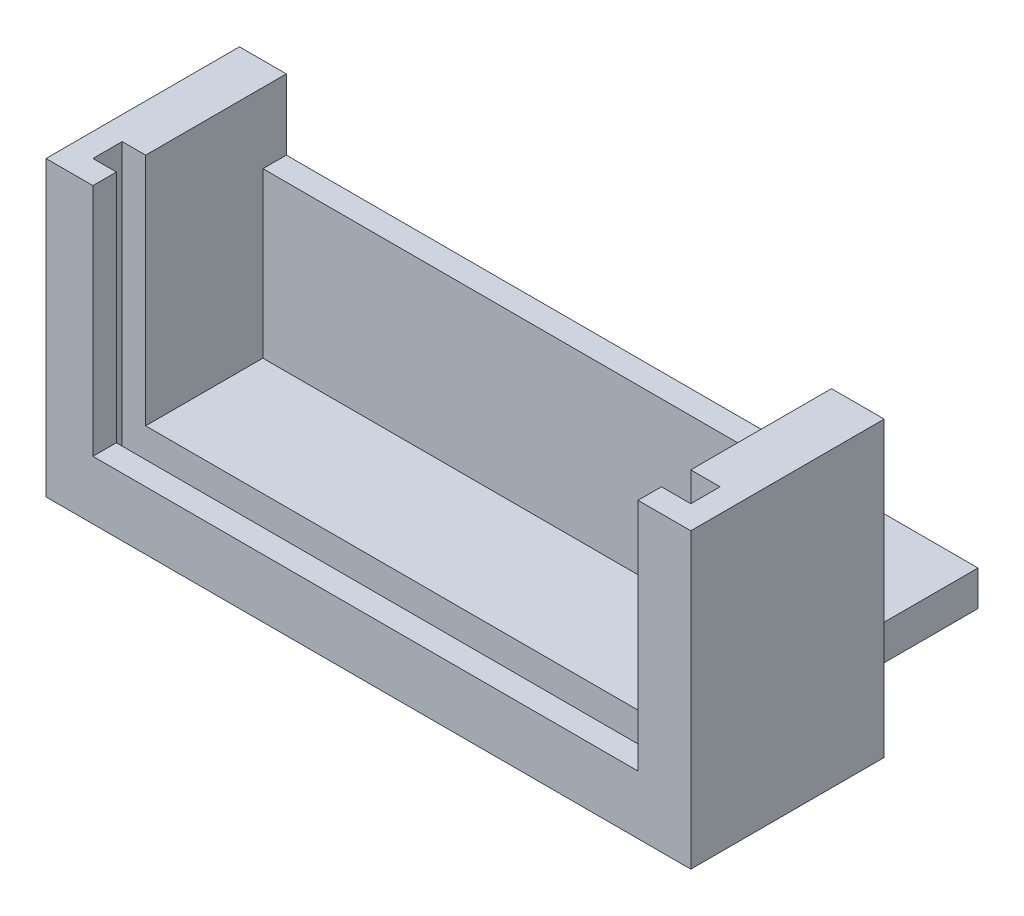
ISO-10303-21;
HEADER;
FILE_DESCRIPTION(('STEP AP214'),'2;1');
FILE_NAME('part.step','',(''),(''),'','','');
FILE_SCHEMA(('AUTOMOTIVE_DESIGN { 1 0 10303 214 1 1 1 1 }'));
ENDSEC;
DATA;
#1=APPLICATION_CONTEXT('core data for automotive mechanical design processes');
#2=APPLICATION_PROTOCOL_DEFINITION('international standard','automotive_design',2000,#1);
#3=PRODUCT_CONTEXT('',#1,'mechanical');
#4=PRODUCT('Part','Part','',(#3));
#5=PRODUCT_RELATED_PRODUCT_CATEGORY('part','',(#4));
#6=PRODUCT_DEFINITION_FORMATION('','',#4);
#7=PRODUCT_DEFINITION_CONTEXT('part definition',#1,'design');
#8=PRODUCT_DEFINITION('design','',#6,#7);
#9=PRODUCT_DEFINITION_SHAPE('','',#8);
#10=(LENGTH_UNIT() NAMED_UNIT(*) SI_UNIT(.MILLI.,.METRE.));
#11=(NAMED_UNIT(*) PLANE_ANGLE_UNIT() SI_UNIT($,.RADIAN.));
#12=(NAMED_UNIT(*) SI_UNIT($,.STERADIAN.) SOLID_ANGLE_UNIT());
#13=UNCERTAINTY_MEASURE_WITH_UNIT(LENGTH_MEASURE(1.E-05),#10,'distance_accuracy_value','');
#14=(GEOMETRIC_REPRESENTATION_CONTEXT(3) GLOBAL_UNCERTAINTY_ASSIGNED_CONTEXT((#13)) GLOBAL_UNIT_ASSIGNED_CONTEXT((#10,
#11,#12)) REPRESENTATION_CONTEXT('',''));
#15=CARTESIAN_POINT('',(0.,0.,0.));
#16=DIRECTION('',(0.,0.,1.));
#17=DIRECTION('',(1.,0.,0.));
#18=AXIS2_PLACEMENT_3D('',#15,#16,#17);
#19=CARTESIAN_POINT('',(0.,25.,16.5));
#20=DIRECTION('',(0.,-1.,0.));
#21=DIRECTION('',(1.,0.,0.));
#22=AXIS2_PLACEMENT_3D('',#19,#20,#21);
#23=PLANE('',#22);
#24=DIRECTION('',(0.,0.,1.));
#25=VECTOR('',#24,1.);
#26=CARTESIAN_POINT('',(4.,25.,2.));
#27=LINE('',#26,#25);
#28=CARTESIAN_POINT('',(4.,25.,0.));
#29=VERTEX_POINT('',#28);
#30=CARTESIAN_POINT('',(4.,25.,12.));
#31=VERTEX_POINT('',#30);
#32=EDGE_CURVE('E324',#29,#31,#27,.T.);
#33=ORIENTED_EDGE('',*,*,#32,.F.);
#34=DIRECTION('',(-1.,0.,0.));
#35=VECTOR('',#34,1.);
#36=CARTESIAN_POINT('',(0.,25.,0.));
#37=LINE('',#36,#35);
#38=CARTESIAN_POINT('',(0.,25.,0.));
#39=VERTEX_POINT('',#38);
#40=EDGE_CURVE('E260',#29,#39,#37,.T.);
#41=ORIENTED_EDGE('',*,*,#40,.T.);
#42=DIRECTION('',(0.,0.,-1.));
#43=VECTOR('',#42,1.);
#44=CARTESIAN_POINT('',(0.,25.,16.5));
#45=LINE('',#44,#43);
#46=CARTESIAN_POINT('',(0.,25.,16.5));
#47=VERTEX_POINT('',#46);
#48=EDGE_CURVE('E250',#47,#39,#45,.T.);
#49=ORIENTED_EDGE('',*,*,#48,.F.);
#50=DIRECTION('',(-1.,0.,0.));
#51=VECTOR('',#50,1.);
#52=CARTESIAN_POINT('',(0.,25.,16.5));
#53=LINE('',#52,#51);
#54=CARTESIAN_POINT('',(4.,25.,16.5));
#55=VERTEX_POINT('',#54);
#56=EDGE_CURVE('E246',#55,#47,#53,.T.);
#57=ORIENTED_EDGE('',*,*,#56,.F.);
#58=DIRECTION('',(0.,0.,1.));
#59=VECTOR('',#58,1.);
#60=CARTESIAN_POINT('',(4.,25.,14.5));
#61=LINE('',#60,#59);
#62=CARTESIAN_POINT('',(4.,25.,14.5));
#63=VERTEX_POINT('',#62);
#64=EDGE_CURVE('E311',#63,#55,#61,.T.);
#65=ORIENTED_EDGE('',*,*,#64,.F.);
#66=DIRECTION('',(1.,0.,0.));
#67=VECTOR('',#66,1.);
#68=CARTESIAN_POINT('',(2.,25.,14.5));
#69=LINE('',#68,#67);
#70=CARTESIAN_POINT('',(2.,25.,14.5));
#71=VERTEX_POINT('',#70);
#72=EDGE_CURVE('E308',#71,#63,#69,.T.);
#73=ORIENTED_EDGE('',*,*,#72,.F.);
#74=DIRECTION('',(0.,0.,1.));
#75=VECTOR('',#74,1.);
#76=CARTESIAN_POINT('',(2.,25.,12.));
#77=LINE('',#76,#75);
#78=CARTESIAN_POINT('',(2.,25.,12.));
#79=VERTEX_POINT('',#78);
#80=EDGE_CURVE('E305',#79,#71,#77,.T.);
#81=ORIENTED_EDGE('',*,*,#80,.F.);
#82=DIRECTION('',(-1.,0.,0.));
#83=VECTOR('',#82,1.);
#84=CARTESIAN_POINT('',(2.,25.,12.));
#85=LINE('',#84,#83);
#86=EDGE_CURVE('E326',#31,#79,#85,.T.);
#87=ORIENTED_EDGE('',*,*,#86,.F.);
#88=EDGE_LOOP('',(#33,#41,#49,#57,#65,#73,#81,#87));
#89=FACE_BOUND('',#88,.T.);
#90=ADVANCED_FACE('F43',(#89),#23,.F.);
#91=CARTESIAN_POINT('',(0.,5.,0.));
#92=DIRECTION('',(0.,1.,0.));
#93=DIRECTION('',(0.,0.,1.));
#94=AXIS2_PLACEMENT_3D('',#91,#92,#93);
#95=PLANE('',#94);
#96=DIRECTION('',(-1.,0.,0.));
#97=VECTOR('',#96,1.);
#98=CARTESIAN_POINT('',(0.,5.,12.));
#99=LINE('',#98,#97);
#100=CARTESIAN_POINT('',(50.5,5.,12.));
#101=VERTEX_POINT('',#100);
#102=CARTESIAN_POINT('',(4.,5.,12.));
#103=VERTEX_POINT('',#102);
#104=EDGE_CURVE('E11',#101,#103,#99,.T.);
#105=ORIENTED_EDGE('',*,*,#104,.F.);
#106=DIRECTION('',(0.,0.,-1.));
#107=VECTOR('',#106,1.);
#108=CARTESIAN_POINT('',(50.5,5.,2.));
#109=LINE('',#108,#107);
#110=CARTESIAN_POINT('',(50.5,5.,2.));
#111=VERTEX_POINT('',#110);
#112=EDGE_CURVE('E294',#101,#111,#109,.T.);
#113=ORIENTED_EDGE('',*,*,#112,.T.);
#114=DIRECTION('',(-1.,0.,0.));
#115=VECTOR('',#114,1.);
#116=CARTESIAN_POINT('',(4.,5.,2.));
#117=LINE('',#116,#115);
#118=CARTESIAN_POINT('',(4.,5.,2.));
#119=VERTEX_POINT('',#118);
#120=EDGE_CURVE('E297',#111,#119,#117,.T.);
#121=ORIENTED_EDGE('',*,*,#120,.T.);
#122=DIRECTION('',(0.,0.,1.));
#123=VECTOR('',#122,1.);
#124=CARTESIAN_POINT('',(4.,5.,2.));
#125=LINE('',#124,#123);
#126=EDGE_CURVE('E212',#119,#103,#125,.T.);
#127=ORIENTED_EDGE('',*,*,#126,.T.);
#128=EDGE_LOOP('',(#105,#113,#121,#127));
#129=FACE_BOUND('',#128,.T.);
#130=ADVANCED_FACE('F437',(#129),#95,.T.);
#131=CARTESIAN_POINT('',(0.,0.,16.5));
#132=DIRECTION('',(1.,0.,0.));
#133=DIRECTION('',(0.,0.,-1.));
#134=AXIS2_PLACEMENT_3D('',#131,#132,#133);
#135=PLANE('',#134);
#136=DIRECTION('',(0.,-1.,0.));
#137=VECTOR('',#136,1.);
#138=CARTESIAN_POINT('',(0.,0.,0.));
#139=LINE('',#138,#137);
#140=CARTESIAN_POINT('',(0.,0.,0.));
#141=VERTEX_POINT('',#140);
#142=EDGE_CURVE('E251',#39,#141,#139,.T.);
#143=ORIENTED_EDGE('',*,*,#142,.T.);
#144=DIRECTION('',(0.,0.,-1.));
#145=VECTOR('',#144,1.);
#146=CARTESIAN_POINT('',(0.,0.,16.5));
#147=LINE('',#146,#145);
#148=CARTESIAN_POINT('',(0.,0.,16.5));
#149=VERTEX_POINT('',#148);
#150=EDGE_CURVE('E271',#149,#141,#147,.T.);
#151=ORIENTED_EDGE('',*,*,#150,.F.);
#152=DIRECTION('',(0.,-1.,0.));
#153=VECTOR('',#152,1.);
#154=CARTESIAN_POINT('',(0.,0.,16.5));
#155=LINE('',#154,#153);
#156=EDGE_CURVE('E238',#47,#149,#155,.T.);
#157=ORIENTED_EDGE('',*,*,#156,.F.);
#158=ORIENTED_EDGE('',*,*,#48,.T.);
#159=EDGE_LOOP('',(#143,#151,#157,#158));
#160=FACE_BOUND('',#159,.T.);
#161=ADVANCED_FACE('F45',(#160),#135,.F.);
#162=CARTESIAN_POINT('',(0.,0.,16.5));
#163=DIRECTION('',(0.,1.,0.));
#164=DIRECTION('',(0.,0.,1.));
#165=AXIS2_PLACEMENT_3D('',#162,#163,#164);
#166=PLANE('',#165);
#167=DIRECTION('',(1.,0.,0.));
#168=VECTOR('',#167,1.);
#169=CARTESIAN_POINT('',(0.,0.,0.));
#170=LINE('',#169,#168);
#171=CARTESIAN_POINT('',(7.,0.,0.));
#172=VERTEX_POINT('',#171);
#173=EDGE_CURVE('E255',#141,#172,#170,.T.);
#174=ORIENTED_EDGE('',*,*,#173,.T.);
#175=DIRECTION('',(0.,0.,1.));
#176=VECTOR('',#175,1.);
#177=CARTESIAN_POINT('',(7.,0.,-15.));
#178=LINE('',#177,#176);
#179=CARTESIAN_POINT('',(7.,0.,-15.));
#180=VERTEX_POINT('',#179);
#181=EDGE_CURVE('E355',#180,#172,#178,.T.);
#182=ORIENTED_EDGE('',*,*,#181,.F.);
#183=DIRECTION('',(-1.,0.,0.));
#184=VECTOR('',#183,1.);
#185=CARTESIAN_POINT('',(48.,0.,-15.));
#186=LINE('',#185,#184);
#187=CARTESIAN_POINT('',(48.,0.,-15.));
#188=VERTEX_POINT('',#187);
#189=EDGE_CURVE('E390',#188,#180,#186,.T.);
#190=ORIENTED_EDGE('',*,*,#189,.F.);
#191=DIRECTION('',(0.,0.,1.));
#192=VECTOR('',#191,1.);
#193=CARTESIAN_POINT('',(48.,0.,-15.));
#194=LINE('',#193,#192);
#195=CARTESIAN_POINT('',(48.,0.,0.));
#196=VERTEX_POINT('',#195);
#197=EDGE_CURVE('E352',#188,#196,#194,.T.);
#198=ORIENTED_EDGE('',*,*,#197,.T.);
#199=CARTESIAN_POINT('',(55.,0.,0.));
#200=VERTEX_POINT('',#199);
#201=EDGE_CURVE('E254',#196,#200,#170,.T.);
#202=ORIENTED_EDGE('',*,*,#201,.T.);
#203=DIRECTION('',(0.,0.,-1.));
#204=VECTOR('',#203,1.);
#205=CARTESIAN_POINT('',(55.,0.,16.5));
#206=LINE('',#205,#204);
#207=CARTESIAN_POINT('',(55.,0.,16.5));
#208=VERTEX_POINT('',#207);
#209=EDGE_CURVE('E268',#208,#200,#206,.T.);
#210=ORIENTED_EDGE('',*,*,#209,.F.);
#211=DIRECTION('',(1.,0.,0.));
#212=VECTOR('',#211,1.);
#213=CARTESIAN_POINT('',(0.,0.,16.5));
#214=LINE('',#213,#212);
#215=EDGE_CURVE('E241',#149,#208,#214,.T.);
#216=ORIENTED_EDGE('',*,*,#215,.F.);
#217=ORIENTED_EDGE('',*,*,#150,.T.);
#218=EDGE_LOOP('',(#174,#182,#190,#198,#202,#210,#216,#217));
#219=FACE_BOUND('',#218,.T.);
#220=ADVANCED_FACE('F414',(#219),#166,.F.);
#221=CARTESIAN_POINT('',(55.,0.,16.5));
#222=DIRECTION('',(-1.,0.,0.));
#223=DIRECTION('',(0.,0.,1.));
#224=AXIS2_PLACEMENT_3D('',#221,#222,#223);
#225=PLANE('',#224);
#226=DIRECTION('',(0.,1.,0.));
#227=VECTOR('',#226,1.);
#228=CARTESIAN_POINT('',(55.,0.,0.));
#229=LINE('',#228,#227);
#230=CARTESIAN_POINT('',(55.,25.,0.));
#231=VERTEX_POINT('',#230);
#232=EDGE_CURVE('E258',#200,#231,#229,.T.);
#233=ORIENTED_EDGE('',*,*,#232,.T.);
#234=DIRECTION('',(0.,0.,-1.));
#235=VECTOR('',#234,1.);
#236=CARTESIAN_POINT('',(55.,25.,16.5));
#237=LINE('',#236,#235);
#238=CARTESIAN_POINT('',(55.,25.,16.5));
#239=VERTEX_POINT('',#238);
#240=EDGE_CURVE('E265',#239,#231,#237,.T.);
#241=ORIENTED_EDGE('',*,*,#240,.F.);
#242=DIRECTION('',(0.,1.,0.));
#243=VECTOR('',#242,1.);
#244=CARTESIAN_POINT('',(55.,0.,16.5));
#245=LINE('',#244,#243);
#246=EDGE_CURVE('E244',#208,#239,#245,.T.);
#247=ORIENTED_EDGE('',*,*,#246,.F.);
#248=ORIENTED_EDGE('',*,*,#209,.T.);
#249=EDGE_LOOP('',(#233,#241,#247,#248));
#250=FACE_BOUND('',#249,.T.);
#251=ADVANCED_FACE('F447',(#250),#225,.F.);
#252=CARTESIAN_POINT('',(50.5,25.,0.));
#253=VERTEX_POINT('',#252);
#254=EDGE_CURVE('E242',#231,#253,#37,.T.);
#255=ORIENTED_EDGE('',*,*,#254,.T.);
#256=DIRECTION('',(0.,0.,-1.));
#257=VECTOR('',#256,1.);
#258=CARTESIAN_POINT('',(50.5,25.,2.));
#259=LINE('',#258,#257);
#260=CARTESIAN_POINT('',(50.5,25.,12.));
#261=VERTEX_POINT('',#260);
#262=EDGE_CURVE('E322',#261,#253,#259,.T.);
#263=ORIENTED_EDGE('',*,*,#262,.F.);
#264=DIRECTION('',(-1.,0.,0.));
#265=VECTOR('',#264,1.);
#266=CARTESIAN_POINT('',(50.5,25.,12.));
#267=LINE('',#266,#265);
#268=CARTESIAN_POINT('',(53.,25.,12.));
#269=VERTEX_POINT('',#268);
#270=EDGE_CURVE('E319',#269,#261,#267,.T.);
#271=ORIENTED_EDGE('',*,*,#270,.F.);
#272=DIRECTION('',(0.,0.,-1.));
#273=VECTOR('',#272,1.);
#274=CARTESIAN_POINT('',(53.,25.,12.));
#275=LINE('',#274,#273);
#276=CARTESIAN_POINT('',(53.,25.,14.5));
#277=VERTEX_POINT('',#276);
#278=EDGE_CURVE('E316',#277,#269,#275,.T.);
#279=ORIENTED_EDGE('',*,*,#278,.F.);
#280=DIRECTION('',(1.,0.,0.));
#281=VECTOR('',#280,1.);
#282=CARTESIAN_POINT('',(50.5,25.,14.5));
#283=LINE('',#282,#281);
#284=CARTESIAN_POINT('',(50.5,25.,14.5));
#285=VERTEX_POINT('',#284);
#286=EDGE_CURVE('E314',#285,#277,#283,.T.);
#287=ORIENTED_EDGE('',*,*,#286,.F.);
#288=DIRECTION('',(0.,0.,-1.));
#289=VECTOR('',#288,1.);
#290=CARTESIAN_POINT('',(50.5,25.,14.5));
#291=LINE('',#290,#289);
#292=CARTESIAN_POINT('',(50.5,25.,16.5));
#293=VERTEX_POINT('',#292);
#294=EDGE_CURVE('E288',#293,#285,#291,.T.);
#295=ORIENTED_EDGE('',*,*,#294,.F.);
#296=EDGE_CURVE('E247',#239,#293,#53,.T.);
#297=ORIENTED_EDGE('',*,*,#296,.F.);
#298=ORIENTED_EDGE('',*,*,#240,.T.);
#299=EDGE_LOOP('',(#255,#263,#271,#279,#287,#295,#297,#298));
#300=FACE_BOUND('',#299,.T.);
#301=ADVANCED_FACE('F367',(#300),#23,.F.);
#302=CARTESIAN_POINT('',(0.,0.,16.5));
#303=DIRECTION('',(0.,0.,-1.));
#304=DIRECTION('',(-1.,0.,0.));
#305=AXIS2_PLACEMENT_3D('',#302,#303,#304);
#306=PLANE('',#305);
#307=ORIENTED_EDGE('',*,*,#296,.T.);
#308=DIRECTION('',(0.,1.,0.));
#309=VECTOR('',#308,1.);
#310=CARTESIAN_POINT('',(50.5,5.,16.5));
#311=LINE('',#310,#309);
#312=CARTESIAN_POINT('',(50.5,5.,16.5));
#313=VERTEX_POINT('',#312);
#314=EDGE_CURVE('E229',#313,#293,#311,.T.);
#315=ORIENTED_EDGE('',*,*,#314,.F.);
#316=DIRECTION('',(1.,0.,0.));
#317=VECTOR('',#316,1.);
#318=CARTESIAN_POINT('',(4.,5.,16.5));
#319=LINE('',#318,#317);
#320=CARTESIAN_POINT('',(4.,5.,16.5));
#321=VERTEX_POINT('',#320);
#322=EDGE_CURVE('E292',#321,#313,#319,.T.);
#323=ORIENTED_EDGE('',*,*,#322,.F.);
#324=DIRECTION('',(0.,1.,0.));
#325=VECTOR('',#324,1.);
#326=CARTESIAN_POINT('',(4.,5.,16.5));
#327=LINE('',#326,#325);
#328=EDGE_CURVE('E231',#321,#55,#327,.T.);
#329=ORIENTED_EDGE('',*,*,#328,.T.);
#330=ORIENTED_EDGE('',*,*,#56,.T.);
#331=ORIENTED_EDGE('',*,*,#156,.T.);
#332=ORIENTED_EDGE('',*,*,#215,.T.);
#333=ORIENTED_EDGE('',*,*,#246,.T.);
#334=EDGE_LOOP('',(#307,#315,#323,#329,#330,#331,#332,#333));
#335=FACE_BOUND('',#334,.T.);
#336=ADVANCED_FACE('F364',(#335),#306,.F.);
#337=CARTESIAN_POINT('',(0.,0.,0.));
#338=DIRECTION('',(0.,0.,-1.));
#339=DIRECTION('',(-1.,0.,0.));
#340=AXIS2_PLACEMENT_3D('',#337,#338,#339);
#341=PLANE('',#340);
#342=DIRECTION('',(0.,1.,0.));
#343=VECTOR('',#342,1.);
#344=CARTESIAN_POINT('',(3.99999999999998,0.,0.));
#345=LINE('',#344,#343);
#346=CARTESIAN_POINT('',(3.99999999999999,19.,0.));
#347=VERTEX_POINT('',#346);
#348=EDGE_CURVE('E382',#347,#29,#345,.T.);
#349=ORIENTED_EDGE('',*,*,#348,.F.);
#350=DIRECTION('',(-1.,0.,0.));
#351=VECTOR('',#350,1.);
#352=CARTESIAN_POINT('',(0.,19.,0.));
#353=LINE('',#352,#351);
#354=CARTESIAN_POINT('',(50.5,19.,0.));
#355=VERTEX_POINT('',#354);
#356=EDGE_CURVE('E193',#355,#347,#353,.T.);
#357=ORIENTED_EDGE('',*,*,#356,.F.);
#358=DIRECTION('',(0.,-1.,0.));
#359=VECTOR('',#358,1.);
#360=CARTESIAN_POINT('',(50.5,0.,0.));
#361=LINE('',#360,#359);
#362=EDGE_CURVE('E379',#253,#355,#361,.T.);
#363=ORIENTED_EDGE('',*,*,#362,.F.);
#364=ORIENTED_EDGE('',*,*,#254,.F.);
#365=ORIENTED_EDGE('',*,*,#232,.F.);
#366=ORIENTED_EDGE('',*,*,#201,.F.);
#367=DIRECTION('',(0.,-1.,0.));
#368=VECTOR('',#367,1.);
#369=CARTESIAN_POINT('',(48.,0.,0.));
#370=LINE('',#369,#368);
#371=CARTESIAN_POINT('',(48.,3.,0.));
#372=VERTEX_POINT('',#371);
#373=EDGE_CURVE('E66',#372,#196,#370,.T.);
#374=ORIENTED_EDGE('',*,*,#373,.F.);
#375=DIRECTION('',(1.,0.,0.));
#376=VECTOR('',#375,1.);
#377=CARTESIAN_POINT('',(48.,3.,0.));
#378=LINE('',#377,#376);
#379=CARTESIAN_POINT('',(7.,3.,0.));
#380=VERTEX_POINT('',#379);
#381=EDGE_CURVE('E391',#380,#372,#378,.T.);
#382=ORIENTED_EDGE('',*,*,#381,.F.);
#383=DIRECTION('',(0.,1.,0.));
#384=VECTOR('',#383,1.);
#385=CARTESIAN_POINT('',(7.,0.,0.));
#386=LINE('',#385,#384);
#387=EDGE_CURVE('E399',#172,#380,#386,.T.);
#388=ORIENTED_EDGE('',*,*,#387,.F.);
#389=ORIENTED_EDGE('',*,*,#173,.F.);
#390=ORIENTED_EDGE('',*,*,#142,.F.);
#391=ORIENTED_EDGE('',*,*,#40,.F.);
#392=EDGE_LOOP('',(#349,#357,#363,#364,#365,#366,#374,#382,#388,#389,#390,#391));
#393=FACE_BOUND('',#392,.T.);
#394=ADVANCED_FACE('F380',(#393),#341,.T.);
#395=CARTESIAN_POINT('',(2.,5.,12.));
#396=DIRECTION('',(-1.,0.,0.));
#397=DIRECTION('',(0.,0.,1.));
#398=AXIS2_PLACEMENT_3D('',#395,#396,#397);
#399=PLANE('',#398);
#400=ORIENTED_EDGE('',*,*,#80,.T.);
#401=DIRECTION('',(0.,1.,0.));
#402=VECTOR('',#401,1.);
#403=CARTESIAN_POINT('',(2.,5.,14.5));
#404=LINE('',#403,#402);
#405=CARTESIAN_POINT('',(2.,2.5,14.5));
#406=VERTEX_POINT('',#405);
#407=EDGE_CURVE('E236',#406,#71,#404,.T.);
#408=ORIENTED_EDGE('',*,*,#407,.F.);
#409=DIRECTION('',(0.,0.,1.));
#410=VECTOR('',#409,1.);
#411=CARTESIAN_POINT('',(2.,2.5,12.));
#412=LINE('',#411,#410);
#413=CARTESIAN_POINT('',(2.,2.5,12.));
#414=VERTEX_POINT('',#413);
#415=EDGE_CURVE('E334',#414,#406,#412,.T.);
#416=ORIENTED_EDGE('',*,*,#415,.F.);
#417=DIRECTION('',(0.,1.,0.));
#418=VECTOR('',#417,1.);
#419=CARTESIAN_POINT('',(2.,5.,12.));
#420=LINE('',#419,#418);
#421=EDGE_CURVE('E216',#414,#79,#420,.T.);
#422=ORIENTED_EDGE('',*,*,#421,.T.);
#423=EDGE_LOOP('',(#400,#408,#416,#422));
#424=FACE_BOUND('',#423,.T.);
#425=ADVANCED_FACE('F330',(#424),#399,.F.);
#426=CARTESIAN_POINT('',(2.,5.,12.));
#427=DIRECTION('',(0.,0.,-1.));
#428=DIRECTION('',(-1.,0.,0.));
#429=AXIS2_PLACEMENT_3D('',#426,#427,#428);
#430=PLANE('',#429);
#431=ORIENTED_EDGE('',*,*,#86,.T.);
#432=ORIENTED_EDGE('',*,*,#421,.F.);
#433=DIRECTION('',(-1.,0.,0.));
#434=VECTOR('',#433,1.);
#435=CARTESIAN_POINT('',(2.,2.5,12.));
#436=LINE('',#435,#434);
#437=CARTESIAN_POINT('',(53.,2.5,12.));
#438=VERTEX_POINT('',#437);
#439=EDGE_CURVE('E309',#438,#414,#436,.T.);
#440=ORIENTED_EDGE('',*,*,#439,.F.);
#441=DIRECTION('',(0.,1.,0.));
#442=VECTOR('',#441,1.);
#443=CARTESIAN_POINT('',(53.,5.,12.));
#444=LINE('',#443,#442);
#445=EDGE_CURVE('E223',#438,#269,#444,.T.);
#446=ORIENTED_EDGE('',*,*,#445,.T.);
#447=ORIENTED_EDGE('',*,*,#270,.T.);
#448=DIRECTION('',(0.,1.,0.));
#449=VECTOR('',#448,1.);
#450=CARTESIAN_POINT('',(50.5,5.,12.));
#451=LINE('',#450,#449);
#452=EDGE_CURVE('E218',#101,#261,#451,.T.);
#453=ORIENTED_EDGE('',*,*,#452,.F.);
#454=ORIENTED_EDGE('',*,*,#104,.T.);
#455=DIRECTION('',(0.,1.,0.));
#456=VECTOR('',#455,1.);
#457=CARTESIAN_POINT('',(4.,5.,12.));
#458=LINE('',#457,#456);
#459=EDGE_CURVE('E214',#103,#31,#458,.T.);
#460=ORIENTED_EDGE('',*,*,#459,.T.);
#461=EDGE_LOOP('',(#431,#432,#440,#446,#447,#453,#454,#460));
#462=FACE_BOUND('',#461,.T.);
#463=ADVANCED_FACE('F339',(#462),#430,.F.);
#464=CARTESIAN_POINT('',(4.,5.,2.));
#465=DIRECTION('',(-1.,0.,0.));
#466=DIRECTION('',(0.,0.,1.));
#467=AXIS2_PLACEMENT_3D('',#464,#465,#466);
#468=PLANE('',#467);
#469=ORIENTED_EDGE('',*,*,#32,.T.);
#470=ORIENTED_EDGE('',*,*,#459,.F.);
#471=ORIENTED_EDGE('',*,*,#126,.F.);
#472=DIRECTION('',(0.,1.,0.));
#473=VECTOR('',#472,1.);
#474=CARTESIAN_POINT('',(4.,5.,2.));
#475=LINE('',#474,#473);
#476=CARTESIAN_POINT('',(3.99999999999999,19.,2.));
#477=VERTEX_POINT('',#476);
#478=EDGE_CURVE('E204',#119,#477,#475,.T.);
#479=ORIENTED_EDGE('',*,*,#478,.T.);
#480=DIRECTION('',(0.,0.,1.));
#481=VECTOR('',#480,1.);
#482=CARTESIAN_POINT('',(3.99999999999999,19.,-13.));
#483=LINE('',#482,#481);
#484=EDGE_CURVE('E190',#347,#477,#483,.T.);
#485=ORIENTED_EDGE('',*,*,#484,.F.);
#486=ORIENTED_EDGE('',*,*,#348,.T.);
#487=EDGE_LOOP('',(#469,#470,#471,#479,#485,#486));
#488=FACE_BOUND('',#487,.T.);
#489=ADVANCED_FACE('F209',(#488),#468,.F.);
#490=CARTESIAN_POINT('',(4.,5.,2.));
#491=DIRECTION('',(0.,0.,-1.));
#492=DIRECTION('',(-1.,0.,0.));
#493=AXIS2_PLACEMENT_3D('',#490,#491,#492);
#494=PLANE('',#493);
#495=DIRECTION('',(0.,1.,0.));
#496=VECTOR('',#495,1.);
#497=CARTESIAN_POINT('',(50.5,5.,2.));
#498=LINE('',#497,#496);
#499=CARTESIAN_POINT('',(50.5,19.,2.));
#500=VERTEX_POINT('',#499);
#501=EDGE_CURVE('E206',#111,#500,#498,.T.);
#502=ORIENTED_EDGE('',*,*,#501,.T.);
#503=DIRECTION('',(1.,0.,0.));
#504=VECTOR('',#503,1.);
#505=CARTESIAN_POINT('',(3.99999999999999,19.,2.));
#506=LINE('',#505,#504);
#507=EDGE_CURVE('E58',#477,#500,#506,.T.);
#508=ORIENTED_EDGE('',*,*,#507,.F.);
#509=ORIENTED_EDGE('',*,*,#478,.F.);
#510=ORIENTED_EDGE('',*,*,#120,.F.);
#511=EDGE_LOOP('',(#502,#508,#509,#510));
#512=FACE_BOUND('',#511,.T.);
#513=ADVANCED_FACE('F202',(#512),#494,.F.);
#514=CARTESIAN_POINT('',(50.5,5.,2.));
#515=DIRECTION('',(1.,0.,0.));
#516=DIRECTION('',(0.,1.,0.));
#517=AXIS2_PLACEMENT_3D('',#514,#515,#516);
#518=PLANE('',#517);
#519=ORIENTED_EDGE('',*,*,#262,.T.);
#520=ORIENTED_EDGE('',*,*,#362,.T.);
#521=DIRECTION('',(0.,0.,1.));
#522=VECTOR('',#521,1.);
#523=CARTESIAN_POINT('',(50.5,19.,-13.));
#524=LINE('',#523,#522);
#525=EDGE_CURVE('E198',#355,#500,#524,.T.);
#526=ORIENTED_EDGE('',*,*,#525,.T.);
#527=ORIENTED_EDGE('',*,*,#501,.F.);
#528=ORIENTED_EDGE('',*,*,#112,.F.);
#529=ORIENTED_EDGE('',*,*,#452,.T.);
#530=EDGE_LOOP('',(#519,#520,#526,#527,#528,#529));
#531=FACE_BOUND('',#530,.T.);
#532=ADVANCED_FACE('F378',(#531),#518,.F.);
#533=CARTESIAN_POINT('',(53.,5.,12.));
#534=DIRECTION('',(1.,0.,0.));
#535=DIRECTION('',(0.,1.,0.));
#536=AXIS2_PLACEMENT_3D('',#533,#534,#535);
#537=PLANE('',#536);
#538=ORIENTED_EDGE('',*,*,#278,.T.);
#539=ORIENTED_EDGE('',*,*,#445,.F.);
#540=DIRECTION('',(0.,0.,-1.));
#541=VECTOR('',#540,1.);
#542=CARTESIAN_POINT('',(53.,2.5,12.));
#543=LINE('',#542,#541);
#544=CARTESIAN_POINT('',(53.,2.5,14.5));
#545=VERTEX_POINT('',#544);
#546=EDGE_CURVE('E349',#545,#438,#543,.T.);
#547=ORIENTED_EDGE('',*,*,#546,.F.);
#548=DIRECTION('',(0.,1.,0.));
#549=VECTOR('',#548,1.);
#550=CARTESIAN_POINT('',(53.,5.,14.5));
#551=LINE('',#550,#549);
#552=EDGE_CURVE('E225',#545,#277,#551,.T.);
#553=ORIENTED_EDGE('',*,*,#552,.T.);
#554=EDGE_LOOP('',(#538,#539,#547,#553));
#555=FACE_BOUND('',#554,.T.);
#556=ADVANCED_FACE('F372',(#555),#537,.F.);
#557=CARTESIAN_POINT('',(50.5,5.,14.5));
#558=DIRECTION('',(0.,0.,1.));
#559=DIRECTION('',(1.,0.,0.));
#560=AXIS2_PLACEMENT_3D('',#557,#558,#559);
#561=PLANE('',#560);
#562=ORIENTED_EDGE('',*,*,#286,.T.);
#563=ORIENTED_EDGE('',*,*,#552,.F.);
#564=DIRECTION('',(1.,0.,0.));
#565=VECTOR('',#564,1.);
#566=CARTESIAN_POINT('',(2.,2.5,14.5));
#567=LINE('',#566,#565);
#568=EDGE_CURVE('E345',#406,#545,#567,.T.);
#569=ORIENTED_EDGE('',*,*,#568,.F.);
#570=ORIENTED_EDGE('',*,*,#407,.T.);
#571=ORIENTED_EDGE('',*,*,#72,.T.);
#572=DIRECTION('',(0.,1.,0.));
#573=VECTOR('',#572,1.);
#574=CARTESIAN_POINT('',(4.,5.,14.5));
#575=LINE('',#574,#573);
#576=CARTESIAN_POINT('',(4.,5.,14.5));
#577=VERTEX_POINT('',#576);
#578=EDGE_CURVE('E234',#577,#63,#575,.T.);
#579=ORIENTED_EDGE('',*,*,#578,.F.);
#580=DIRECTION('',(1.,0.,0.));
#581=VECTOR('',#580,1.);
#582=CARTESIAN_POINT('',(0.,5.,14.5));
#583=LINE('',#582,#581);
#584=CARTESIAN_POINT('',(50.5,5.,14.5));
#585=VERTEX_POINT('',#584);
#586=EDGE_CURVE('E51',#577,#585,#583,.T.);
#587=ORIENTED_EDGE('',*,*,#586,.T.);
#588=DIRECTION('',(0.,1.,0.));
#589=VECTOR('',#588,1.);
#590=CARTESIAN_POINT('',(50.5,5.,14.5));
#591=LINE('',#590,#589);
#592=EDGE_CURVE('E227',#585,#285,#591,.T.);
#593=ORIENTED_EDGE('',*,*,#592,.T.);
#594=EDGE_LOOP('',(#562,#563,#569,#570,#571,#579,#587,#593));
#595=FACE_BOUND('',#594,.T.);
#596=ADVANCED_FACE('F277',(#595),#561,.F.);
#597=CARTESIAN_POINT('',(50.5,5.,14.5));
#598=DIRECTION('',(1.,0.,0.));
#599=DIRECTION('',(0.,0.,-1.));
#600=AXIS2_PLACEMENT_3D('',#597,#598,#599);
#601=PLANE('',#600);
#602=ORIENTED_EDGE('',*,*,#294,.T.);
#603=ORIENTED_EDGE('',*,*,#592,.F.);
#604=DIRECTION('',(0.,0.,-1.));
#605=VECTOR('',#604,1.);
#606=CARTESIAN_POINT('',(50.5,5.,14.5));
#607=LINE('',#606,#605);
#608=EDGE_CURVE('E285',#313,#585,#607,.T.);
#609=ORIENTED_EDGE('',*,*,#608,.F.);
#610=ORIENTED_EDGE('',*,*,#314,.T.);
#611=EDGE_LOOP('',(#602,#603,#609,#610));
#612=FACE_BOUND('',#611,.T.);
#613=ADVANCED_FACE('F284',(#612),#601,.F.);
#614=CARTESIAN_POINT('',(4.,5.,14.5));
#615=DIRECTION('',(-1.,0.,0.));
#616=DIRECTION('',(0.,-1.,0.));
#617=AXIS2_PLACEMENT_3D('',#614,#615,#616);
#618=PLANE('',#617);
#619=ORIENTED_EDGE('',*,*,#64,.T.);
#620=ORIENTED_EDGE('',*,*,#328,.F.);
#621=DIRECTION('',(0.,0.,1.));
#622=VECTOR('',#621,1.);
#623=CARTESIAN_POINT('',(4.,5.,14.5));
#624=LINE('',#623,#622);
#625=EDGE_CURVE('E299',#577,#321,#624,.T.);
#626=ORIENTED_EDGE('',*,*,#625,.F.);
#627=ORIENTED_EDGE('',*,*,#578,.T.);
#628=EDGE_LOOP('',(#619,#620,#626,#627));
#629=FACE_BOUND('',#628,.T.);
#630=ADVANCED_FACE('F362',(#629),#618,.F.);
#631=ORIENTED_EDGE('',*,*,#586,.F.);
#632=ORIENTED_EDGE('',*,*,#625,.T.);
#633=ORIENTED_EDGE('',*,*,#322,.T.);
#634=ORIENTED_EDGE('',*,*,#608,.T.);
#635=EDGE_LOOP('',(#631,#632,#633,#634));
#636=FACE_BOUND('',#635,.T.);
#637=ADVANCED_FACE('F290',(#636),#95,.T.);
#638=CARTESIAN_POINT('',(0.,2.5,0.));
#639=DIRECTION('',(0.,1.,0.));
#640=DIRECTION('',(0.,0.,1.));
#641=AXIS2_PLACEMENT_3D('',#638,#639,#640);
#642=PLANE('',#641);
#643=ORIENTED_EDGE('',*,*,#415,.T.);
#644=ORIENTED_EDGE('',*,*,#568,.T.);
#645=ORIENTED_EDGE('',*,*,#546,.T.);
#646=ORIENTED_EDGE('',*,*,#439,.T.);
#647=EDGE_LOOP('',(#643,#644,#645,#646));
#648=FACE_BOUND('',#647,.T.);
#649=ADVANCED_FACE('F351',(#648),#642,.T.);
#650=CARTESIAN_POINT('',(48.,0.,-15.));
#651=DIRECTION('',(-1.,0.,0.));
#652=DIRECTION('',(0.,0.,1.));
#653=AXIS2_PLACEMENT_3D('',#650,#651,#652);
#654=PLANE('',#653);
#655=ORIENTED_EDGE('',*,*,#373,.T.);
#656=ORIENTED_EDGE('',*,*,#197,.F.);
#657=DIRECTION('',(0.,-1.,0.));
#658=VECTOR('',#657,1.);
#659=CARTESIAN_POINT('',(48.,0.,-15.));
#660=LINE('',#659,#658);
#661=CARTESIAN_POINT('',(48.,3.,-15.));
#662=VERTEX_POINT('',#661);
#663=EDGE_CURVE('E387',#662,#188,#660,.T.);
#664=ORIENTED_EDGE('',*,*,#663,.F.);
#665=DIRECTION('',(0.,0.,1.));
#666=VECTOR('',#665,1.);
#667=CARTESIAN_POINT('',(48.,3.,-15.));
#668=LINE('',#667,#666);
#669=EDGE_CURVE('E397',#662,#372,#668,.T.);
#670=ORIENTED_EDGE('',*,*,#669,.T.);
#671=EDGE_LOOP('',(#655,#656,#664,#670));
#672=FACE_BOUND('',#671,.T.);
#673=ADVANCED_FACE('F424',(#672),#654,.F.);
#674=CARTESIAN_POINT('',(7.,0.,-15.));
#675=DIRECTION('',(1.,0.,0.));
#676=DIRECTION('',(0.,0.,-1.));
#677=AXIS2_PLACEMENT_3D('',#674,#675,#676);
#678=PLANE('',#677);
#679=ORIENTED_EDGE('',*,*,#387,.T.);
#680=DIRECTION('',(0.,0.,1.));
#681=VECTOR('',#680,1.);
#682=CARTESIAN_POINT('',(7.,3.,-15.));
#683=LINE('',#682,#681);
#684=CARTESIAN_POINT('',(7.,3.,-15.));
#685=VERTEX_POINT('',#684);
#686=EDGE_CURVE('E405',#685,#380,#683,.T.);
#687=ORIENTED_EDGE('',*,*,#686,.F.);
#688=DIRECTION('',(0.,1.,0.));
#689=VECTOR('',#688,1.);
#690=CARTESIAN_POINT('',(7.,0.,-15.));
#691=LINE('',#690,#689);
#692=EDGE_CURVE('E393',#180,#685,#691,.T.);
#693=ORIENTED_EDGE('',*,*,#692,.F.);
#694=ORIENTED_EDGE('',*,*,#181,.T.);
#695=EDGE_LOOP('',(#679,#687,#693,#694));
#696=FACE_BOUND('',#695,.T.);
#697=ADVANCED_FACE('F411',(#696),#678,.F.);
#698=CARTESIAN_POINT('',(48.,3.,-15.));
#699=DIRECTION('',(0.,-1.,0.));
#700=DIRECTION('',(0.,0.,-1.));
#701=AXIS2_PLACEMENT_3D('',#698,#699,#700);
#702=PLANE('',#701);
#703=ORIENTED_EDGE('',*,*,#381,.T.);
#704=ORIENTED_EDGE('',*,*,#669,.F.);
#705=DIRECTION('',(1.,0.,0.));
#706=VECTOR('',#705,1.);
#707=CARTESIAN_POINT('',(48.,3.,-15.));
#708=LINE('',#707,#706);
#709=EDGE_CURVE('E395',#685,#662,#708,.T.);
#710=ORIENTED_EDGE('',*,*,#709,.F.);
#711=ORIENTED_EDGE('',*,*,#686,.T.);
#712=EDGE_LOOP('',(#703,#704,#710,#711));
#713=FACE_BOUND('',#712,.T.);
#714=ADVANCED_FACE('F420',(#713),#702,.F.);
#715=CARTESIAN_POINT('',(0.,0.,-15.));
#716=DIRECTION('',(0.,0.,1.));
#717=DIRECTION('',(1.,0.,0.));
#718=AXIS2_PLACEMENT_3D('',#715,#716,#717);
#719=PLANE('',#718);
#720=ORIENTED_EDGE('',*,*,#663,.T.);
#721=ORIENTED_EDGE('',*,*,#189,.T.);
#722=ORIENTED_EDGE('',*,*,#692,.T.);
#723=ORIENTED_EDGE('',*,*,#709,.T.);
#724=EDGE_LOOP('',(#720,#721,#722,#723));
#725=FACE_BOUND('',#724,.T.);
#726=ADVANCED_FACE('F427',(#725),#719,.F.);
#727=CARTESIAN_POINT('',(3.99999999999999,19.,-13.));
#728=DIRECTION('',(0.,-1.,0.));
#729=DIRECTION('',(1.,0.,0.));
#730=AXIS2_PLACEMENT_3D('',#727,#728,#729);
#731=PLANE('',#730);
#732=ORIENTED_EDGE('',*,*,#356,.T.);
#733=ORIENTED_EDGE('',*,*,#484,.T.);
#734=ORIENTED_EDGE('',*,*,#507,.T.);
#735=ORIENTED_EDGE('',*,*,#525,.F.);
#736=EDGE_LOOP('',(#732,#733,#734,#735));
#737=FACE_BOUND('',#736,.T.);
#738=ADVANCED_FACE('F191',(#737),#731,.F.);
#739=CLOSED_SHELL('',(#90,#130,#161,#220,#251,#301,#336,#394,#425,#463,#489,#513,#532,#556,#596,
#613,#630,#637,#649,#673,#697,#714,#726,#738));
#740=MANIFOLD_SOLID_BREP('B2',#739);
#741=ADVANCED_BREP_SHAPE_REPRESENTATION('',(#18,#740),#14);
#742=SHAPE_DEFINITION_REPRESENTATION(#9,#741);
ENDSEC;
END-ISO-10303-21;
